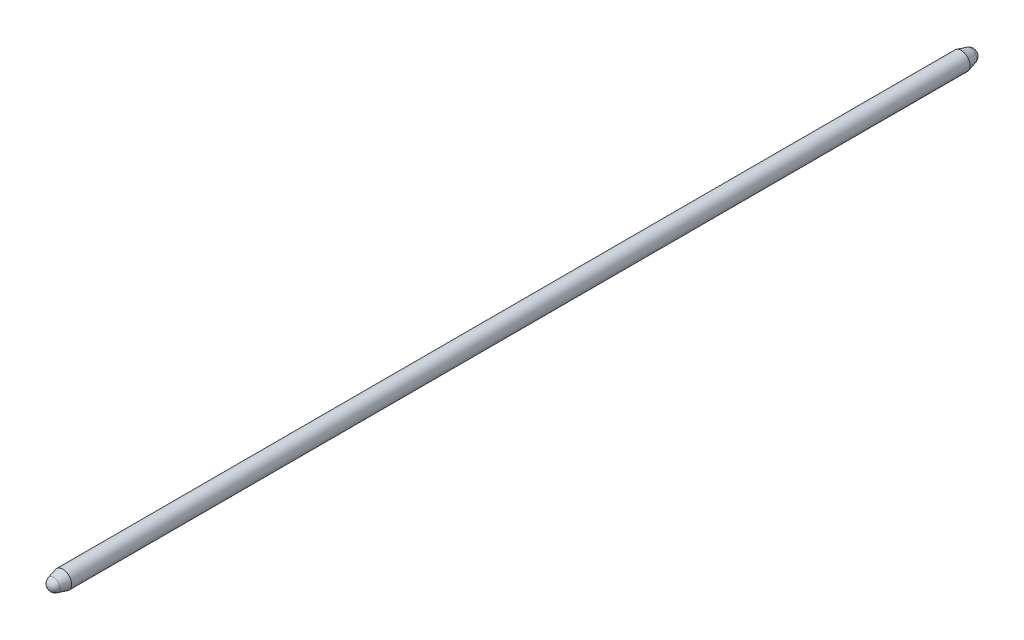
ISO-10303-21;
HEADER;
FILE_DESCRIPTION(('STEP AP214'),'2;1');
FILE_NAME('part.step','',(''),(''),'','','');
FILE_SCHEMA(('AUTOMOTIVE_DESIGN { 1 0 10303 214 1 1 1 1 }'));
ENDSEC;
DATA;
#1=APPLICATION_CONTEXT('core data for automotive mechanical design processes');
#2=APPLICATION_PROTOCOL_DEFINITION('international standard','automotive_design',2000,#1);
#3=PRODUCT_CONTEXT('',#1,'mechanical');
#4=PRODUCT('Part','Part','',(#3));
#5=PRODUCT_RELATED_PRODUCT_CATEGORY('part','',(#4));
#6=PRODUCT_DEFINITION_FORMATION('','',#4);
#7=PRODUCT_DEFINITION_CONTEXT('part definition',#1,'design');
#8=PRODUCT_DEFINITION('design','',#6,#7);
#9=PRODUCT_DEFINITION_SHAPE('','',#8);
#10=(LENGTH_UNIT() NAMED_UNIT(*) SI_UNIT(.MILLI.,.METRE.));
#11=(NAMED_UNIT(*) PLANE_ANGLE_UNIT() SI_UNIT($,.RADIAN.));
#12=(NAMED_UNIT(*) SI_UNIT($,.STERADIAN.) SOLID_ANGLE_UNIT());
#13=UNCERTAINTY_MEASURE_WITH_UNIT(LENGTH_MEASURE(1.E-05),#10,'distance_accuracy_value','');
#14=(GEOMETRIC_REPRESENTATION_CONTEXT(3) GLOBAL_UNCERTAINTY_ASSIGNED_CONTEXT((#13)) GLOBAL_UNIT_ASSIGNED_CONTEXT((#10,
#11,#12)) REPRESENTATION_CONTEXT('',''));
#15=CARTESIAN_POINT('',(0.,0.,0.));
#16=DIRECTION('',(0.,0.,1.));
#17=DIRECTION('',(1.,0.,0.));
#18=AXIS2_PLACEMENT_3D('',#15,#16,#17);
#19=CARTESIAN_POINT('',(0.,0.,-1310.74214766694));
#20=DIRECTION('',(0.,0.,-1.));
#21=DIRECTION('',(0.,1.,0.));
#22=AXIS2_PLACEMENT_3D('',#19,#20,#21);
#23=SPHERICAL_SURFACE('',#22,19.05);
#24=CARTESIAN_POINT('',(0.,0.,-1315.67265047614));
#25=DIRECTION('',(0.,0.,-1.));
#26=DIRECTION('',(0.,1.,0.));
#27=AXIS2_PLACEMENT_3D('',#24,#25,#26);
#28=CIRCLE('',#27,18.4008869908067);
#29=CARTESIAN_POINT('',(0.,18.4008869908068,-1315.67265047614));
#30=VERTEX_POINT('',#29);
#31=EDGE_CURVE('E10',#30,#30,#28,.T.);
#32=ORIENTED_EDGE('',*,*,#31,.T.);
#33=EDGE_LOOP('',(#32));
#34=FACE_BOUND('',#33,.T.);
#35=ADVANCED_FACE('F31',(#34),#23,.T.);
#36=CARTESIAN_POINT('',(0.,0.,-1315.67265047614));
#37=DIRECTION('',(0.,0.,1.));
#38=DIRECTION('',(0.,-1.,0.));
#39=AXIS2_PLACEMENT_3D('',#36,#37,#38);
#40=CONICAL_SURFACE('',#39,18.4008869908067,0.26179938779915);
#41=CARTESIAN_POINT('',(0.,0.,-1289.55160511791));
#42=DIRECTION('',(0.,0.,-1.));
#43=DIRECTION('',(0.,1.,0.));
#44=AXIS2_PLACEMENT_3D('',#41,#42,#43);
#45=CIRCLE('',#44,25.4);
#46=CARTESIAN_POINT('',(0.,25.4,-1289.55160511791));
#47=VERTEX_POINT('',#46);
#48=EDGE_CURVE('E38',#47,#47,#45,.T.);
#49=ORIENTED_EDGE('',*,*,#48,.T.);
#50=EDGE_LOOP('',(#49));
#51=FACE_BOUND('',#50,.T.);
#52=ORIENTED_EDGE('',*,*,#31,.F.);
#53=EDGE_LOOP('',(#52));
#54=FACE_BOUND('',#53,.T.);
#55=ADVANCED_FACE('F86',(#51,#54),#40,.T.);
#56=CARTESIAN_POINT('',(0.,0.,-1329.79214766694));
#57=DIRECTION('',(0.,0.,-1.));
#58=DIRECTION('',(0.,1.,0.));
#59=AXIS2_PLACEMENT_3D('',#56,#57,#58);
#60=CYLINDRICAL_SURFACE('',#59,25.4);
#61=CARTESIAN_POINT('',(0.,0.,1289.55160511791));
#62=DIRECTION('',(0.,0.,-1.));
#63=DIRECTION('',(0.,1.,0.));
#64=AXIS2_PLACEMENT_3D('',#61,#62,#63);
#65=CIRCLE('',#64,25.4);
#66=CARTESIAN_POINT('',(0.,25.4,1289.55160511791));
#67=VERTEX_POINT('',#66);
#68=EDGE_CURVE('E42',#67,#67,#65,.T.);
#69=ORIENTED_EDGE('',*,*,#68,.T.);
#70=EDGE_LOOP('',(#69));
#71=FACE_BOUND('',#70,.T.);
#72=ORIENTED_EDGE('',*,*,#48,.F.);
#73=EDGE_LOOP('',(#72));
#74=FACE_BOUND('',#73,.T.);
#75=ADVANCED_FACE('F83',(#71,#74),#60,.T.);
#76=CARTESIAN_POINT('',(0.,0.,1289.55160511791));
#77=DIRECTION('',(0.,0.,-1.));
#78=DIRECTION('',(0.,1.,0.));
#79=AXIS2_PLACEMENT_3D('',#76,#77,#78);
#80=CONICAL_SURFACE('',#79,25.4,0.26179938779915);
#81=CARTESIAN_POINT('',(0.,0.,1315.67265047614));
#82=DIRECTION('',(0.,0.,-1.));
#83=DIRECTION('',(0.,1.,0.));
#84=AXIS2_PLACEMENT_3D('',#81,#82,#83);
#85=CIRCLE('',#84,18.4008869908068);
#86=CARTESIAN_POINT('',(0.,18.4008869908068,1315.67265047614));
#87=VERTEX_POINT('',#86);
#88=EDGE_CURVE('E46',#87,#87,#85,.T.);
#89=ORIENTED_EDGE('',*,*,#88,.T.);
#90=EDGE_LOOP('',(#89));
#91=FACE_BOUND('',#90,.T.);
#92=ORIENTED_EDGE('',*,*,#68,.F.);
#93=EDGE_LOOP('',(#92));
#94=FACE_BOUND('',#93,.T.);
#95=ADVANCED_FACE('F79',(#91,#94),#80,.T.);
#96=CARTESIAN_POINT('',(0.,0.,1310.74214766694));
#97=DIRECTION('',(0.,0.,-1.));
#98=DIRECTION('',(0.,1.,0.));
#99=AXIS2_PLACEMENT_3D('',#96,#97,#98);
#100=SPHERICAL_SURFACE('',#99,19.05);
#101=ORIENTED_EDGE('',*,*,#88,.F.);
#102=EDGE_LOOP('',(#101));
#103=FACE_BOUND('',#102,.T.);
#104=ADVANCED_FACE('F77',(#103),#100,.T.);
#105=CLOSED_SHELL('',(#35,#55,#75,#95,#104));
#106=CARTESIAN_POINT('',(0.,0.,1289.55160511791));
#107=DIRECTION('',(0.,0.,-1.));
#108=DIRECTION('',(0.,1.,0.));
#109=AXIS2_PLACEMENT_3D('',#106,#107,#108);
#110=PLANE('',#109);
#111=CARTESIAN_POINT('',(0.,0.,1289.55160511791));
#112=DIRECTION('',(0.,0.,-1.));
#113=DIRECTION('',(0.,1.,0.));
#114=AXIS2_PLACEMENT_3D('',#111,#112,#113);
#115=CIRCLE('',#114,22.9869999999997);
#116=CARTESIAN_POINT('',(0.,22.9869999999997,1289.55160511791));
#117=VERTEX_POINT('',#116);
#118=EDGE_CURVE('E51',#117,#117,#115,.T.);
#119=ORIENTED_EDGE('',*,*,#118,.T.);
#120=EDGE_LOOP('',(#119));
#121=FACE_BOUND('',#120,.T.);
#122=ADVANCED_FACE('F68',(#121),#110,.T.);
#123=CARTESIAN_POINT('',(0.,0.,-1329.79214766694));
#124=DIRECTION('',(0.,0.,-1.));
#125=DIRECTION('',(0.,1.,0.));
#126=AXIS2_PLACEMENT_3D('',#123,#124,#125);
#127=CYLINDRICAL_SURFACE('',#126,22.9869999999998);
#128=CARTESIAN_POINT('',(0.,0.,-1289.55160511791));
#129=DIRECTION('',(0.,0.,-1.));
#130=DIRECTION('',(0.,1.,0.));
#131=AXIS2_PLACEMENT_3D('',#128,#129,#130);
#132=CIRCLE('',#131,22.9869999999997);
#133=CARTESIAN_POINT('',(0.,22.9869999999997,-1289.55160511791));
#134=VERTEX_POINT('',#133);
#135=EDGE_CURVE('E54',#134,#134,#132,.T.);
#136=ORIENTED_EDGE('',*,*,#135,.T.);
#137=EDGE_LOOP('',(#136));
#138=FACE_BOUND('',#137,.T.);
#139=ORIENTED_EDGE('',*,*,#118,.F.);
#140=EDGE_LOOP('',(#139));
#141=FACE_BOUND('',#140,.T.);
#142=ADVANCED_FACE('F58',(#138,#141),#127,.F.);
#143=CARTESIAN_POINT('',(0.,0.,-1289.55160511791));
#144=DIRECTION('',(0.,0.,1.));
#145=DIRECTION('',(0.,-1.,0.));
#146=AXIS2_PLACEMENT_3D('',#143,#144,#145);
#147=PLANE('',#146);
#148=ORIENTED_EDGE('',*,*,#135,.F.);
#149=EDGE_LOOP('',(#148));
#150=FACE_BOUND('',#149,.T.);
#151=ADVANCED_FACE('F61',(#150),#147,.T.);
#152=CLOSED_SHELL('',(#122,#142,#151));
#153=ORIENTED_CLOSED_SHELL('',*,#152,.T.);
#154=BREP_WITH_VOIDS('B2',#105,(#153));
#155=ADVANCED_BREP_SHAPE_REPRESENTATION('',(#18,#154),#14);
#156=SHAPE_DEFINITION_REPRESENTATION(#9,#155);
ENDSEC;
END-ISO-10303-21;
